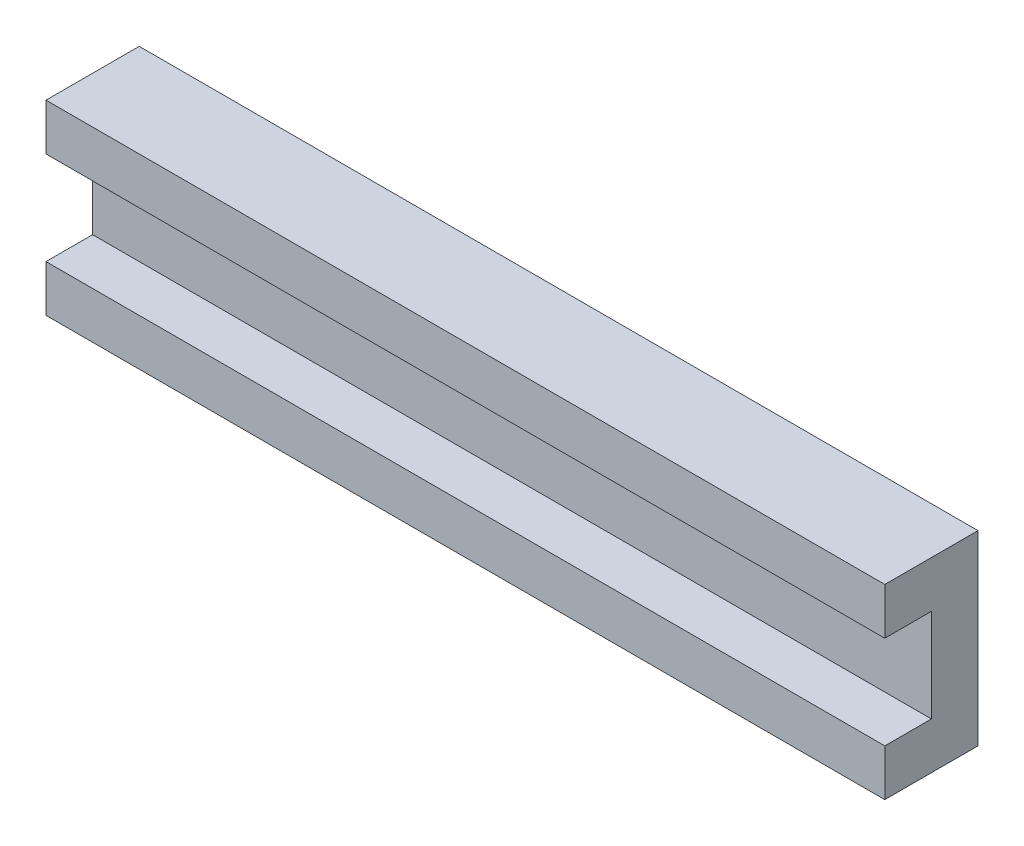
ISO-10303-21;
HEADER;
FILE_DESCRIPTION(('STEP AP214'),'2;1');
FILE_NAME('part.step','',(''),(''),'','','');
FILE_SCHEMA(('AUTOMOTIVE_DESIGN { 1 0 10303 214 1 1 1 1 }'));
ENDSEC;
DATA;
#1=APPLICATION_CONTEXT('core data for automotive mechanical design processes');
#2=APPLICATION_PROTOCOL_DEFINITION('international standard','automotive_design',2000,#1);
#3=PRODUCT_CONTEXT('',#1,'mechanical');
#4=PRODUCT('Part','Part','',(#3));
#5=PRODUCT_RELATED_PRODUCT_CATEGORY('part','',(#4));
#6=PRODUCT_DEFINITION_FORMATION('','',#4);
#7=PRODUCT_DEFINITION_CONTEXT('part definition',#1,'design');
#8=PRODUCT_DEFINITION('design','',#6,#7);
#9=PRODUCT_DEFINITION_SHAPE('','',#8);
#10=(LENGTH_UNIT() NAMED_UNIT(*) SI_UNIT(.MILLI.,.METRE.));
#11=(NAMED_UNIT(*) PLANE_ANGLE_UNIT() SI_UNIT($,.RADIAN.));
#12=(NAMED_UNIT(*) SI_UNIT($,.STERADIAN.) SOLID_ANGLE_UNIT());
#13=UNCERTAINTY_MEASURE_WITH_UNIT(LENGTH_MEASURE(1.E-05),#10,'distance_accuracy_value','');
#14=(GEOMETRIC_REPRESENTATION_CONTEXT(3) GLOBAL_UNCERTAINTY_ASSIGNED_CONTEXT((#13)) GLOBAL_UNIT_ASSIGNED_CONTEXT((#10,
#11,#12)) REPRESENTATION_CONTEXT('',''));
#15=CARTESIAN_POINT('',(0.,0.,0.));
#16=DIRECTION('',(0.,0.,1.));
#17=DIRECTION('',(1.,0.,0.));
#18=AXIS2_PLACEMENT_3D('',#15,#16,#17);
#19=CARTESIAN_POINT('',(45.,0.,10.));
#20=DIRECTION('',(-1.,0.,0.));
#21=DIRECTION('',(0.,0.,1.));
#22=AXIS2_PLACEMENT_3D('',#19,#20,#21);
#23=PLANE('',#22);
#24=DIRECTION('',(0.,0.,-1.));
#25=VECTOR('',#24,1.);
#26=CARTESIAN_POINT('',(45.,-5.,22.));
#27=LINE('',#26,#25);
#28=CARTESIAN_POINT('',(45.,-5.,10.));
#29=VERTEX_POINT('',#28);
#30=CARTESIAN_POINT('',(45.,-5.,5.));
#31=VERTEX_POINT('',#30);
#32=EDGE_CURVE('E11',#29,#31,#27,.T.);
#33=ORIENTED_EDGE('',*,*,#32,.F.);
#34=DIRECTION('',(0.,1.,0.));
#35=VECTOR('',#34,1.);
#36=CARTESIAN_POINT('',(45.,-10.,10.));
#37=LINE('',#36,#35);
#38=CARTESIAN_POINT('',(45.,-10.,10.));
#39=VERTEX_POINT('',#38);
#40=EDGE_CURVE('E175',#39,#29,#37,.T.);
#41=ORIENTED_EDGE('',*,*,#40,.F.);
#42=DIRECTION('',(0.,0.,-1.));
#43=VECTOR('',#42,1.);
#44=CARTESIAN_POINT('',(45.,-10.,10.));
#45=LINE('',#44,#43);
#46=CARTESIAN_POINT('',(45.,-10.,0.));
#47=VERTEX_POINT('',#46);
#48=EDGE_CURVE('E158',#39,#47,#45,.T.);
#49=ORIENTED_EDGE('',*,*,#48,.T.);
#50=DIRECTION('',(0.,1.,0.));
#51=VECTOR('',#50,1.);
#52=CARTESIAN_POINT('',(45.,0.,0.));
#53=LINE('',#52,#51);
#54=CARTESIAN_POINT('',(45.,10.,0.));
#55=VERTEX_POINT('',#54);
#56=EDGE_CURVE('E42',#47,#55,#53,.T.);
#57=ORIENTED_EDGE('',*,*,#56,.T.);
#58=DIRECTION('',(0.,0.,-1.));
#59=VECTOR('',#58,1.);
#60=CARTESIAN_POINT('',(45.,10.,10.));
#61=LINE('',#60,#59);
#62=CARTESIAN_POINT('',(45.,10.,10.));
#63=VERTEX_POINT('',#62);
#64=EDGE_CURVE('E135',#63,#55,#61,.T.);
#65=ORIENTED_EDGE('',*,*,#64,.F.);
#66=DIRECTION('',(0.,1.,0.));
#67=VECTOR('',#66,1.);
#68=CARTESIAN_POINT('',(45.,-10.,10.));
#69=LINE('',#68,#67);
#70=CARTESIAN_POINT('',(45.,5.,10.));
#71=VERTEX_POINT('',#70);
#72=EDGE_CURVE('E137',#71,#63,#69,.T.);
#73=ORIENTED_EDGE('',*,*,#72,.F.);
#74=DIRECTION('',(0.,0.,-1.));
#75=VECTOR('',#74,1.);
#76=CARTESIAN_POINT('',(45.,5.,22.));
#77=LINE('',#76,#75);
#78=CARTESIAN_POINT('',(45.,5.,5.));
#79=VERTEX_POINT('',#78);
#80=EDGE_CURVE('E109',#71,#79,#77,.T.);
#81=ORIENTED_EDGE('',*,*,#80,.T.);
#82=DIRECTION('',(0.,1.,0.));
#83=VECTOR('',#82,1.);
#84=CARTESIAN_POINT('',(45.,5.,5.));
#85=LINE('',#84,#83);
#86=EDGE_CURVE('E154',#31,#79,#85,.T.);
#87=ORIENTED_EDGE('',*,*,#86,.F.);
#88=EDGE_LOOP('',(#33,#41,#49,#57,#65,#73,#81,#87));
#89=FACE_BOUND('',#88,.T.);
#90=ADVANCED_FACE('F39',(#89),#23,.F.);
#91=CARTESIAN_POINT('',(-45.,0.,10.));
#92=DIRECTION('',(1.,0.,0.));
#93=DIRECTION('',(0.,0.,-1.));
#94=AXIS2_PLACEMENT_3D('',#91,#92,#93);
#95=PLANE('',#94);
#96=DIRECTION('',(0.,0.,-1.));
#97=VECTOR('',#96,1.);
#98=CARTESIAN_POINT('',(-45.,-5.,22.));
#99=LINE('',#98,#97);
#100=CARTESIAN_POINT('',(-45.,-5.,10.));
#101=VERTEX_POINT('',#100);
#102=CARTESIAN_POINT('',(-45.,-5.,5.));
#103=VERTEX_POINT('',#102);
#104=EDGE_CURVE('E176',#101,#103,#99,.T.);
#105=ORIENTED_EDGE('',*,*,#104,.T.);
#106=DIRECTION('',(0.,-1.,0.));
#107=VECTOR('',#106,1.);
#108=CARTESIAN_POINT('',(-45.,-5.,5.));
#109=LINE('',#108,#107);
#110=CARTESIAN_POINT('',(-45.,5.,5.));
#111=VERTEX_POINT('',#110);
#112=EDGE_CURVE('E122',#111,#103,#109,.T.);
#113=ORIENTED_EDGE('',*,*,#112,.F.);
#114=DIRECTION('',(0.,0.,-1.));
#115=VECTOR('',#114,1.);
#116=CARTESIAN_POINT('',(-45.,5.,22.));
#117=LINE('',#116,#115);
#118=CARTESIAN_POINT('',(-45.,5.,10.));
#119=VERTEX_POINT('',#118);
#120=EDGE_CURVE('E106',#119,#111,#117,.T.);
#121=ORIENTED_EDGE('',*,*,#120,.F.);
#122=DIRECTION('',(0.,-1.,0.));
#123=VECTOR('',#122,1.);
#124=CARTESIAN_POINT('',(-45.,9.99999999999999,10.));
#125=LINE('',#124,#123);
#126=CARTESIAN_POINT('',(-45.,9.99999999999999,10.));
#127=VERTEX_POINT('',#126);
#128=EDGE_CURVE('E120',#127,#119,#125,.T.);
#129=ORIENTED_EDGE('',*,*,#128,.F.);
#130=DIRECTION('',(0.,0.,-1.));
#131=VECTOR('',#130,1.);
#132=CARTESIAN_POINT('',(-45.,9.99999999999999,10.));
#133=LINE('',#132,#131);
#134=CARTESIAN_POINT('',(-45.,9.99999999999999,0.));
#135=VERTEX_POINT('',#134);
#136=EDGE_CURVE('E131',#127,#135,#133,.T.);
#137=ORIENTED_EDGE('',*,*,#136,.T.);
#138=DIRECTION('',(0.,-1.,0.));
#139=VECTOR('',#138,1.);
#140=CARTESIAN_POINT('',(-45.,0.,0.));
#141=LINE('',#140,#139);
#142=CARTESIAN_POINT('',(-45.,-10.,0.));
#143=VERTEX_POINT('',#142);
#144=EDGE_CURVE('E178',#135,#143,#141,.T.);
#145=ORIENTED_EDGE('',*,*,#144,.T.);
#146=DIRECTION('',(0.,0.,-1.));
#147=VECTOR('',#146,1.);
#148=CARTESIAN_POINT('',(-45.,-10.,10.));
#149=LINE('',#148,#147);
#150=CARTESIAN_POINT('',(-45.,-10.,10.));
#151=VERTEX_POINT('',#150);
#152=EDGE_CURVE('E48',#151,#143,#149,.T.);
#153=ORIENTED_EDGE('',*,*,#152,.F.);
#154=DIRECTION('',(0.,-1.,0.));
#155=VECTOR('',#154,1.);
#156=CARTESIAN_POINT('',(-45.,9.99999999999999,10.));
#157=LINE('',#156,#155);
#158=EDGE_CURVE('E172',#101,#151,#157,.T.);
#159=ORIENTED_EDGE('',*,*,#158,.F.);
#160=EDGE_LOOP('',(#105,#113,#121,#129,#137,#145,#153,#159));
#161=FACE_BOUND('',#160,.T.);
#162=ADVANCED_FACE('F118',(#161),#95,.F.);
#163=CARTESIAN_POINT('',(0.,0.,10.));
#164=DIRECTION('',(0.,0.,1.));
#165=DIRECTION('',(1.,0.,0.));
#166=AXIS2_PLACEMENT_3D('',#163,#164,#165);
#167=PLANE('',#166);
#168=ORIENTED_EDGE('',*,*,#40,.T.);
#169=DIRECTION('',(-1.,0.,0.));
#170=VECTOR('',#169,1.);
#171=CARTESIAN_POINT('',(0.,-5.,10.));
#172=LINE('',#171,#170);
#173=EDGE_CURVE('E60',#29,#101,#172,.T.);
#174=ORIENTED_EDGE('',*,*,#173,.T.);
#175=ORIENTED_EDGE('',*,*,#158,.T.);
#176=DIRECTION('',(1.,0.,0.));
#177=VECTOR('',#176,1.);
#178=CARTESIAN_POINT('',(-45.,-10.,10.));
#179=LINE('',#178,#177);
#180=EDGE_CURVE('E169',#151,#39,#179,.T.);
#181=ORIENTED_EDGE('',*,*,#180,.T.);
#182=EDGE_LOOP('',(#168,#174,#175,#181));
#183=FACE_BOUND('',#182,.T.);
#184=ADVANCED_FACE('F215',(#183),#167,.T.);
#185=CARTESIAN_POINT('',(0.,0.,0.));
#186=DIRECTION('',(0.,0.,1.));
#187=DIRECTION('',(1.,0.,0.));
#188=AXIS2_PLACEMENT_3D('',#185,#186,#187);
#189=PLANE('',#188);
#190=ORIENTED_EDGE('',*,*,#144,.F.);
#191=DIRECTION('',(-1.,0.,0.));
#192=VECTOR('',#191,1.);
#193=CARTESIAN_POINT('',(45.,10.,0.));
#194=LINE('',#193,#192);
#195=EDGE_CURVE('E114',#55,#135,#194,.T.);
#196=ORIENTED_EDGE('',*,*,#195,.F.);
#197=ORIENTED_EDGE('',*,*,#56,.F.);
#198=DIRECTION('',(1.,0.,0.));
#199=VECTOR('',#198,1.);
#200=CARTESIAN_POINT('',(-45.,-10.,0.));
#201=LINE('',#200,#199);
#202=EDGE_CURVE('E162',#143,#47,#201,.T.);
#203=ORIENTED_EDGE('',*,*,#202,.F.);
#204=EDGE_LOOP('',(#190,#196,#197,#203));
#205=FACE_BOUND('',#204,.T.);
#206=ADVANCED_FACE('F194',(#205),#189,.F.);
#207=CARTESIAN_POINT('',(-45.,-10.,10.));
#208=DIRECTION('',(0.,1.,0.));
#209=DIRECTION('',(0.,0.,1.));
#210=AXIS2_PLACEMENT_3D('',#207,#208,#209);
#211=PLANE('',#210);
#212=ORIENTED_EDGE('',*,*,#202,.T.);
#213=ORIENTED_EDGE('',*,*,#48,.F.);
#214=ORIENTED_EDGE('',*,*,#180,.F.);
#215=ORIENTED_EDGE('',*,*,#152,.T.);
#216=EDGE_LOOP('',(#212,#213,#214,#215));
#217=FACE_BOUND('',#216,.T.);
#218=ADVANCED_FACE('F192',(#217),#211,.F.);
#219=CARTESIAN_POINT('',(45.,-5.,22.));
#220=DIRECTION('',(0.,1.,0.));
#221=DIRECTION('',(0.,0.,1.));
#222=AXIS2_PLACEMENT_3D('',#219,#220,#221);
#223=PLANE('',#222);
#224=DIRECTION('',(1.,0.,0.));
#225=VECTOR('',#224,1.);
#226=CARTESIAN_POINT('',(0.,-5.,5.));
#227=LINE('',#226,#225);
#228=EDGE_CURVE('E55',#103,#31,#227,.T.);
#229=ORIENTED_EDGE('',*,*,#228,.F.);
#230=ORIENTED_EDGE('',*,*,#104,.F.);
#231=ORIENTED_EDGE('',*,*,#173,.F.);
#232=ORIENTED_EDGE('',*,*,#32,.T.);
#233=EDGE_LOOP('',(#229,#230,#231,#232));
#234=FACE_BOUND('',#233,.T.);
#235=ADVANCED_FACE('F224',(#234),#223,.T.);
#236=CARTESIAN_POINT('',(0.,0.,5.));
#237=DIRECTION('',(0.,0.,-1.));
#238=DIRECTION('',(-1.,0.,0.));
#239=AXIS2_PLACEMENT_3D('',#236,#237,#238);
#240=PLANE('',#239);
#241=DIRECTION('',(-1.,0.,0.));
#242=VECTOR('',#241,1.);
#243=CARTESIAN_POINT('',(0.,5.,5.));
#244=LINE('',#243,#242);
#245=EDGE_CURVE('E147',#79,#111,#244,.T.);
#246=ORIENTED_EDGE('',*,*,#245,.T.);
#247=ORIENTED_EDGE('',*,*,#112,.T.);
#248=ORIENTED_EDGE('',*,*,#228,.T.);
#249=ORIENTED_EDGE('',*,*,#86,.T.);
#250=EDGE_LOOP('',(#246,#247,#248,#249));
#251=FACE_BOUND('',#250,.T.);
#252=ADVANCED_FACE('F208',(#251),#240,.F.);
#253=CARTESIAN_POINT('',(0.,5.,22.));
#254=DIRECTION('',(0.,-1.,0.));
#255=DIRECTION('',(0.,0.,-1.));
#256=AXIS2_PLACEMENT_3D('',#253,#254,#255);
#257=PLANE('',#256);
#258=ORIENTED_EDGE('',*,*,#245,.F.);
#259=ORIENTED_EDGE('',*,*,#80,.F.);
#260=DIRECTION('',(1.,0.,0.));
#261=VECTOR('',#260,1.);
#262=CARTESIAN_POINT('',(0.,5.,10.));
#263=LINE('',#262,#261);
#264=EDGE_CURVE('E103',#119,#71,#263,.T.);
#265=ORIENTED_EDGE('',*,*,#264,.F.);
#266=ORIENTED_EDGE('',*,*,#120,.T.);
#267=EDGE_LOOP('',(#258,#259,#265,#266));
#268=FACE_BOUND('',#267,.T.);
#269=ADVANCED_FACE('F105',(#268),#257,.T.);
#270=CARTESIAN_POINT('',(45.,10.,10.));
#271=DIRECTION('',(0.,-1.,0.));
#272=DIRECTION('',(1.,0.,0.));
#273=AXIS2_PLACEMENT_3D('',#270,#271,#272);
#274=PLANE('',#273);
#275=ORIENTED_EDGE('',*,*,#195,.T.);
#276=ORIENTED_EDGE('',*,*,#136,.F.);
#277=DIRECTION('',(-1.,0.,0.));
#278=VECTOR('',#277,1.);
#279=CARTESIAN_POINT('',(45.,10.,10.));
#280=LINE('',#279,#278);
#281=EDGE_CURVE('E128',#63,#127,#280,.T.);
#282=ORIENTED_EDGE('',*,*,#281,.F.);
#283=ORIENTED_EDGE('',*,*,#64,.T.);
#284=EDGE_LOOP('',(#275,#276,#282,#283));
#285=FACE_BOUND('',#284,.T.);
#286=ADVANCED_FACE('F200',(#285),#274,.F.);
#287=CARTESIAN_POINT('',(0.,0.,10.));
#288=DIRECTION('',(0.,0.,1.));
#289=DIRECTION('',(1.,0.,0.));
#290=AXIS2_PLACEMENT_3D('',#287,#288,#289);
#291=PLANE('',#290);
#292=ORIENTED_EDGE('',*,*,#128,.T.);
#293=ORIENTED_EDGE('',*,*,#264,.T.);
#294=ORIENTED_EDGE('',*,*,#72,.T.);
#295=ORIENTED_EDGE('',*,*,#281,.T.);
#296=EDGE_LOOP('',(#292,#293,#294,#295));
#297=FACE_BOUND('',#296,.T.);
#298=ADVANCED_FACE('F126',(#297),#291,.T.);
#299=CLOSED_SHELL('',(#90,#162,#184,#206,#218,#235,#252,#269,#286,#298));
#300=MANIFOLD_SOLID_BREP('B2',#299);
#301=ADVANCED_BREP_SHAPE_REPRESENTATION('',(#18,#300),#14);
#302=SHAPE_DEFINITION_REPRESENTATION(#9,#301);
ENDSEC;
END-ISO-10303-21;
